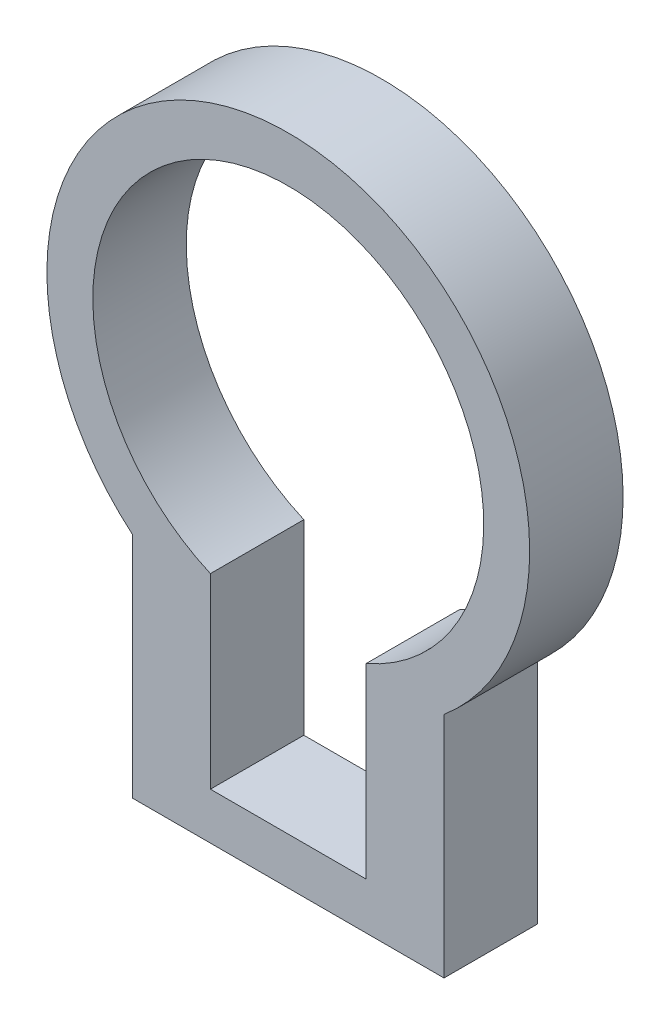
ISO-10303-21;
HEADER;
FILE_DESCRIPTION(('STEP AP214'),'2;1');
FILE_NAME('part.step','',(''),(''),'','','');
FILE_SCHEMA(('AUTOMOTIVE_DESIGN { 1 0 10303 214 1 1 1 1 }'));
ENDSEC;
DATA;
#1=APPLICATION_CONTEXT('core data for automotive mechanical design processes');
#2=APPLICATION_PROTOCOL_DEFINITION('international standard','automotive_design',2000,#1);
#3=PRODUCT_CONTEXT('',#1,'mechanical');
#4=PRODUCT('Part','Part','',(#3));
#5=PRODUCT_RELATED_PRODUCT_CATEGORY('part','',(#4));
#6=PRODUCT_DEFINITION_FORMATION('','',#4);
#7=PRODUCT_DEFINITION_CONTEXT('part definition',#1,'design');
#8=PRODUCT_DEFINITION('design','',#6,#7);
#9=PRODUCT_DEFINITION_SHAPE('','',#8);
#10=(LENGTH_UNIT() NAMED_UNIT(*) SI_UNIT(.MILLI.,.METRE.));
#11=(NAMED_UNIT(*) PLANE_ANGLE_UNIT() SI_UNIT($,.RADIAN.));
#12=(NAMED_UNIT(*) SI_UNIT($,.STERADIAN.) SOLID_ANGLE_UNIT());
#13=UNCERTAINTY_MEASURE_WITH_UNIT(LENGTH_MEASURE(1.E-05),#10,'distance_accuracy_value','');
#14=(GEOMETRIC_REPRESENTATION_CONTEXT(3) GLOBAL_UNCERTAINTY_ASSIGNED_CONTEXT((#13)) GLOBAL_UNIT_ASSIGNED_CONTEXT((#10,
#11,#12)) REPRESENTATION_CONTEXT('',''));
#15=CARTESIAN_POINT('',(0.,0.,0.));
#16=DIRECTION('',(0.,0.,1.));
#17=DIRECTION('',(1.,0.,0.));
#18=AXIS2_PLACEMENT_3D('',#15,#16,#17);
#19=CARTESIAN_POINT('',(-9.99999999999999,-8.5,6.));
#20=DIRECTION('',(1.,0.,0.));
#21=DIRECTION('',(0.,0.,-1.));
#22=AXIS2_PLACEMENT_3D('',#19,#20,#21);
#23=PLANE('',#22);
#24=DIRECTION('',(0.,-1.,0.));
#25=VECTOR('',#24,1.);
#26=CARTESIAN_POINT('',(-9.99999999999999,-8.5,6.));
#27=LINE('',#26,#25);
#28=CARTESIAN_POINT('',(-9.99999999999999,6.15728071767296,6.));
#29=VERTEX_POINT('',#28);
#30=CARTESIAN_POINT('',(-9.99999999999999,-8.5,6.));
#31=VERTEX_POINT('',#30);
#32=EDGE_CURVE('E92',#29,#31,#27,.T.);
#33=ORIENTED_EDGE('',*,*,#32,.F.);
#34=DIRECTION('',(0.,0.,1.));
#35=VECTOR('',#34,1.);
#36=CARTESIAN_POINT('',(-9.99999999999999,6.15728071767296,0.));
#37=LINE('',#36,#35);
#38=CARTESIAN_POINT('',(-9.99999999999999,6.15728071767296,0.));
#39=VERTEX_POINT('',#38);
#40=EDGE_CURVE('E135',#29,#39,#37,.F.);
#41=ORIENTED_EDGE('',*,*,#40,.T.);
#42=DIRECTION('',(0.,-1.,0.));
#43=VECTOR('',#42,1.);
#44=CARTESIAN_POINT('',(-9.99999999999999,-8.5,0.));
#45=LINE('',#44,#43);
#46=CARTESIAN_POINT('',(-9.99999999999999,-8.5,0.));
#47=VERTEX_POINT('',#46);
#48=EDGE_CURVE('E79',#39,#47,#45,.T.);
#49=ORIENTED_EDGE('',*,*,#48,.T.);
#50=DIRECTION('',(0.,0.,-1.));
#51=VECTOR('',#50,1.);
#52=CARTESIAN_POINT('',(-9.99999999999999,-8.5,6.));
#53=LINE('',#52,#51);
#54=EDGE_CURVE('E74',#31,#47,#53,.T.);
#55=ORIENTED_EDGE('',*,*,#54,.F.);
#56=EDGE_LOOP('',(#33,#41,#49,#55));
#57=FACE_BOUND('',#56,.T.);
#58=ADVANCED_FACE('F32',(#57),#23,.F.);
#59=CARTESIAN_POINT('',(9.99999999999999,-8.5,6.));
#60=DIRECTION('',(0.,1.,0.));
#61=DIRECTION('',(0.,0.,1.));
#62=AXIS2_PLACEMENT_3D('',#59,#60,#61);
#63=PLANE('',#62);
#64=DIRECTION('',(1.,0.,0.));
#65=VECTOR('',#64,1.);
#66=CARTESIAN_POINT('',(9.99999999999999,-8.5,0.));
#67=LINE('',#66,#65);
#68=CARTESIAN_POINT('',(9.99999999999999,-8.5,0.));
#69=VERTEX_POINT('',#68);
#70=EDGE_CURVE('E68',#47,#69,#67,.T.);
#71=ORIENTED_EDGE('',*,*,#70,.T.);
#72=DIRECTION('',(0.,0.,-1.));
#73=VECTOR('',#72,1.);
#74=CARTESIAN_POINT('',(9.99999999999999,-8.5,6.));
#75=LINE('',#74,#73);
#76=CARTESIAN_POINT('',(9.99999999999999,-8.5,6.));
#77=VERTEX_POINT('',#76);
#78=EDGE_CURVE('E71',#77,#69,#75,.T.);
#79=ORIENTED_EDGE('',*,*,#78,.F.);
#80=DIRECTION('',(1.,0.,0.));
#81=VECTOR('',#80,1.);
#82=CARTESIAN_POINT('',(9.99999999999999,-8.5,6.));
#83=LINE('',#82,#81);
#84=EDGE_CURVE('E55',#31,#77,#83,.T.);
#85=ORIENTED_EDGE('',*,*,#84,.F.);
#86=ORIENTED_EDGE('',*,*,#54,.T.);
#87=EDGE_LOOP('',(#71,#79,#85,#86));
#88=FACE_BOUND('',#87,.T.);
#89=ADVANCED_FACE('F70',(#88),#63,.F.);
#90=CARTESIAN_POINT('',(9.99999999999999,-8.5,6.));
#91=DIRECTION('',(-1.,0.,0.));
#92=DIRECTION('',(0.,0.,1.));
#93=AXIS2_PLACEMENT_3D('',#90,#91,#92);
#94=PLANE('',#93);
#95=DIRECTION('',(0.,1.,0.));
#96=VECTOR('',#95,1.);
#97=CARTESIAN_POINT('',(9.99999999999999,-8.5,0.));
#98=LINE('',#97,#96);
#99=CARTESIAN_POINT('',(9.99999999999999,6.157280717673,0.));
#100=VERTEX_POINT('',#99);
#101=EDGE_CURVE('E78',#69,#100,#98,.T.);
#102=ORIENTED_EDGE('',*,*,#101,.T.);
#103=DIRECTION('',(0.,0.,1.));
#104=VECTOR('',#103,1.);
#105=CARTESIAN_POINT('',(9.99999999999999,6.157280717673,0.));
#106=LINE('',#105,#104);
#107=CARTESIAN_POINT('',(9.99999999999999,6.157280717673,6.));
#108=VERTEX_POINT('',#107);
#109=EDGE_CURVE('E132',#100,#108,#106,.T.);
#110=ORIENTED_EDGE('',*,*,#109,.T.);
#111=DIRECTION('',(0.,1.,0.));
#112=VECTOR('',#111,1.);
#113=CARTESIAN_POINT('',(9.99999999999999,-8.5,6.));
#114=LINE('',#113,#112);
#115=EDGE_CURVE('E86',#77,#108,#114,.T.);
#116=ORIENTED_EDGE('',*,*,#115,.F.);
#117=ORIENTED_EDGE('',*,*,#78,.T.);
#118=EDGE_LOOP('',(#102,#110,#116,#117));
#119=FACE_BOUND('',#118,.T.);
#120=ADVANCED_FACE('F83',(#119),#94,.F.);
#121=CARTESIAN_POINT('',(0.,0.,6.));
#122=DIRECTION('',(0.,0.,1.));
#123=DIRECTION('',(1.,0.,0.));
#124=AXIS2_PLACEMENT_3D('',#121,#122,#123);
#125=PLANE('',#124);
#126=DIRECTION('',(0.,-1.,0.));
#127=VECTOR('',#126,1.);
#128=CARTESIAN_POINT('',(-5.,6.48902697423019,6.));
#129=LINE('',#128,#127);
#130=CARTESIAN_POINT('',(-5.,6.48902697423019,6.));
#131=VERTEX_POINT('',#130);
#132=CARTESIAN_POINT('',(-5.,-5.5,6.));
#133=VERTEX_POINT('',#132);
#134=EDGE_CURVE('E248',#131,#133,#129,.T.);
#135=ORIENTED_EDGE('',*,*,#134,.F.);
#136=CARTESIAN_POINT('',(0.,18.,6.));
#137=DIRECTION('',(0.,0.,1.));
#138=DIRECTION('',(1.,0.,0.));
#139=AXIS2_PLACEMENT_3D('',#136,#137,#138);
#140=CIRCLE('',#139,12.55);
#141=CARTESIAN_POINT('',(4.99999999999995,6.48902697423018,6.));
#142=VERTEX_POINT('',#141);
#143=EDGE_CURVE('E111',#142,#131,#140,.T.);
#144=ORIENTED_EDGE('',*,*,#143,.F.);
#145=DIRECTION('',(0.,1.,0.));
#146=VECTOR('',#145,1.);
#147=CARTESIAN_POINT('',(4.99999999999999,6.48902697423019,6.));
#148=LINE('',#147,#146);
#149=CARTESIAN_POINT('',(5.,-5.5,6.));
#150=VERTEX_POINT('',#149);
#151=EDGE_CURVE('E46',#150,#142,#148,.T.);
#152=ORIENTED_EDGE('',*,*,#151,.F.);
#153=DIRECTION('',(1.,0.,0.));
#154=VECTOR('',#153,1.);
#155=CARTESIAN_POINT('',(-5.,-5.5,6.));
#156=LINE('',#155,#154);
#157=EDGE_CURVE('E246',#133,#150,#156,.T.);
#158=ORIENTED_EDGE('',*,*,#157,.F.);
#159=EDGE_LOOP('',(#135,#144,#152,#158));
#160=FACE_BOUND('',#159,.T.);
#161=CARTESIAN_POINT('',(0.,18.,6.));
#162=DIRECTION('',(0.,0.,1.));
#163=DIRECTION('',(1.,0.,0.));
#164=AXIS2_PLACEMENT_3D('',#161,#162,#163);
#165=CIRCLE('',#164,15.5);
#166=EDGE_CURVE('E124',#108,#29,#165,.T.);
#167=ORIENTED_EDGE('',*,*,#166,.T.);
#168=ORIENTED_EDGE('',*,*,#32,.T.);
#169=ORIENTED_EDGE('',*,*,#84,.T.);
#170=ORIENTED_EDGE('',*,*,#115,.T.);
#171=EDGE_LOOP('',(#167,#168,#169,#170));
#172=FACE_BOUND('',#171,.T.);
#173=ADVANCED_FACE('F153',(#160,#172),#125,.T.);
#174=CARTESIAN_POINT('',(0.,0.,0.));
#175=DIRECTION('',(0.,0.,1.));
#176=DIRECTION('',(1.,0.,0.));
#177=AXIS2_PLACEMENT_3D('',#174,#175,#176);
#178=PLANE('',#177);
#179=CARTESIAN_POINT('',(0.,18.,0.));
#180=DIRECTION('',(0.,0.,1.));
#181=DIRECTION('',(1.,0.,0.));
#182=AXIS2_PLACEMENT_3D('',#179,#180,#181);
#183=CIRCLE('',#182,12.55);
#184=CARTESIAN_POINT('',(4.99999999999999,6.48902697423019,0.));
#185=VERTEX_POINT('',#184);
#186=CARTESIAN_POINT('',(-5.,6.48902697423019,0.));
#187=VERTEX_POINT('',#186);
#188=EDGE_CURVE('E108',#185,#187,#183,.T.);
#189=ORIENTED_EDGE('',*,*,#188,.T.);
#190=DIRECTION('',(0.,-1.,0.));
#191=VECTOR('',#190,1.);
#192=CARTESIAN_POINT('',(-5.,0.,0.));
#193=LINE('',#192,#191);
#194=CARTESIAN_POINT('',(-5.,-5.5,0.));
#195=VERTEX_POINT('',#194);
#196=EDGE_CURVE('E121',#187,#195,#193,.T.);
#197=ORIENTED_EDGE('',*,*,#196,.T.);
#198=DIRECTION('',(1.,0.,0.));
#199=VECTOR('',#198,1.);
#200=CARTESIAN_POINT('',(0.,-5.5,0.));
#201=LINE('',#200,#199);
#202=CARTESIAN_POINT('',(5.,-5.5,0.));
#203=VERTEX_POINT('',#202);
#204=EDGE_CURVE('E11',#195,#203,#201,.T.);
#205=ORIENTED_EDGE('',*,*,#204,.T.);
#206=DIRECTION('',(0.,1.,0.));
#207=VECTOR('',#206,1.);
#208=CARTESIAN_POINT('',(5.,0.,0.));
#209=LINE('',#208,#207);
#210=EDGE_CURVE('E123',#203,#185,#209,.T.);
#211=ORIENTED_EDGE('',*,*,#210,.T.);
#212=EDGE_LOOP('',(#189,#197,#205,#211));
#213=FACE_BOUND('',#212,.T.);
#214=ORIENTED_EDGE('',*,*,#48,.F.);
#215=CARTESIAN_POINT('',(0.,18.,0.));
#216=DIRECTION('',(0.,0.,1.));
#217=DIRECTION('',(1.,0.,0.));
#218=AXIS2_PLACEMENT_3D('',#215,#216,#217);
#219=CIRCLE('',#218,15.5);
#220=EDGE_CURVE('E91',#100,#39,#219,.T.);
#221=ORIENTED_EDGE('',*,*,#220,.F.);
#222=ORIENTED_EDGE('',*,*,#101,.F.);
#223=ORIENTED_EDGE('',*,*,#70,.F.);
#224=EDGE_LOOP('',(#214,#221,#222,#223));
#225=FACE_BOUND('',#224,.T.);
#226=ADVANCED_FACE('F89',(#213,#225),#178,.F.);
#227=CARTESIAN_POINT('',(0.,18.,0.));
#228=DIRECTION('',(0.,0.,1.));
#229=DIRECTION('',(1.,0.,0.));
#230=AXIS2_PLACEMENT_3D('',#227,#228,#229);
#231=CYLINDRICAL_SURFACE('',#230,15.5);
#232=ORIENTED_EDGE('',*,*,#40,.F.);
#233=ORIENTED_EDGE('',*,*,#166,.F.);
#234=ORIENTED_EDGE('',*,*,#109,.F.);
#235=ORIENTED_EDGE('',*,*,#220,.T.);
#236=EDGE_LOOP('',(#232,#233,#234,#235));
#237=FACE_BOUND('',#236,.T.);
#238=ADVANCED_FACE('F152',(#237),#231,.T.);
#239=CARTESIAN_POINT('',(0.,18.,0.));
#240=DIRECTION('',(0.,0.,1.));
#241=DIRECTION('',(1.,0.,0.));
#242=AXIS2_PLACEMENT_3D('',#239,#240,#241);
#243=CYLINDRICAL_SURFACE('',#242,12.55);
#244=ORIENTED_EDGE('',*,*,#143,.T.);
#245=DIRECTION('',(0.,0.,1.));
#246=VECTOR('',#245,1.);
#247=CARTESIAN_POINT('',(-4.99999999999999,6.48902697423018,0.));
#248=LINE('',#247,#246);
#249=EDGE_CURVE('E39',#131,#187,#248,.F.);
#250=ORIENTED_EDGE('',*,*,#249,.T.);
#251=ORIENTED_EDGE('',*,*,#188,.F.);
#252=DIRECTION('',(0.,0.,1.));
#253=VECTOR('',#252,1.);
#254=CARTESIAN_POINT('',(4.99999999999999,6.4890269742302,0.));
#255=LINE('',#254,#253);
#256=EDGE_CURVE('E98',#185,#142,#255,.T.);
#257=ORIENTED_EDGE('',*,*,#256,.T.);
#258=EDGE_LOOP('',(#244,#250,#251,#257));
#259=FACE_BOUND('',#258,.T.);
#260=ADVANCED_FACE('F106',(#259),#243,.F.);
#261=CARTESIAN_POINT('',(-5.,-5.5,-4.));
#262=DIRECTION('',(0.,-1.,0.));
#263=DIRECTION('',(1.,0.,0.));
#264=AXIS2_PLACEMENT_3D('',#261,#262,#263);
#265=PLANE('',#264);
#266=DIRECTION('',(0.,0.,1.));
#267=VECTOR('',#266,1.);
#268=CARTESIAN_POINT('',(-5.,-5.5,-4.));
#269=LINE('',#268,#267);
#270=EDGE_CURVE('E242',#195,#133,#269,.T.);
#271=ORIENTED_EDGE('',*,*,#270,.T.);
#272=ORIENTED_EDGE('',*,*,#157,.T.);
#273=DIRECTION('',(0.,0.,1.));
#274=VECTOR('',#273,1.);
#275=CARTESIAN_POINT('',(5.,-5.5,-4.));
#276=LINE('',#275,#274);
#277=EDGE_CURVE('E237',#203,#150,#276,.T.);
#278=ORIENTED_EDGE('',*,*,#277,.F.);
#279=ORIENTED_EDGE('',*,*,#204,.F.);
#280=EDGE_LOOP('',(#271,#272,#278,#279));
#281=FACE_BOUND('',#280,.T.);
#282=ADVANCED_FACE('F204',(#281),#265,.F.);
#283=CARTESIAN_POINT('',(-5.,6.48902697423019,-4.));
#284=DIRECTION('',(-1.,0.,0.));
#285=DIRECTION('',(0.,-1.,0.));
#286=AXIS2_PLACEMENT_3D('',#283,#284,#285);
#287=PLANE('',#286);
#288=ORIENTED_EDGE('',*,*,#249,.F.);
#289=ORIENTED_EDGE('',*,*,#134,.T.);
#290=ORIENTED_EDGE('',*,*,#270,.F.);
#291=ORIENTED_EDGE('',*,*,#196,.F.);
#292=EDGE_LOOP('',(#288,#289,#290,#291));
#293=FACE_BOUND('',#292,.T.);
#294=ADVANCED_FACE('F213',(#293),#287,.F.);
#295=CARTESIAN_POINT('',(4.99999999999999,6.48902697423019,-4.));
#296=DIRECTION('',(1.,0.,0.));
#297=DIRECTION('',(0.,1.,0.));
#298=AXIS2_PLACEMENT_3D('',#295,#296,#297);
#299=PLANE('',#298);
#300=ORIENTED_EDGE('',*,*,#277,.T.);
#301=ORIENTED_EDGE('',*,*,#151,.T.);
#302=ORIENTED_EDGE('',*,*,#256,.F.);
#303=ORIENTED_EDGE('',*,*,#210,.F.);
#304=EDGE_LOOP('',(#300,#301,#302,#303));
#305=FACE_BOUND('',#304,.T.);
#306=ADVANCED_FACE('F223',(#305),#299,.F.);
#307=CLOSED_SHELL('',(#58,#89,#120,#173,#226,#238,#260,#282,#294,#306));
#308=MANIFOLD_SOLID_BREP('B2',#307);
#309=ADVANCED_BREP_SHAPE_REPRESENTATION('',(#18,#308),#14);
#310=SHAPE_DEFINITION_REPRESENTATION(#9,#309);
ENDSEC;
END-ISO-10303-21;
